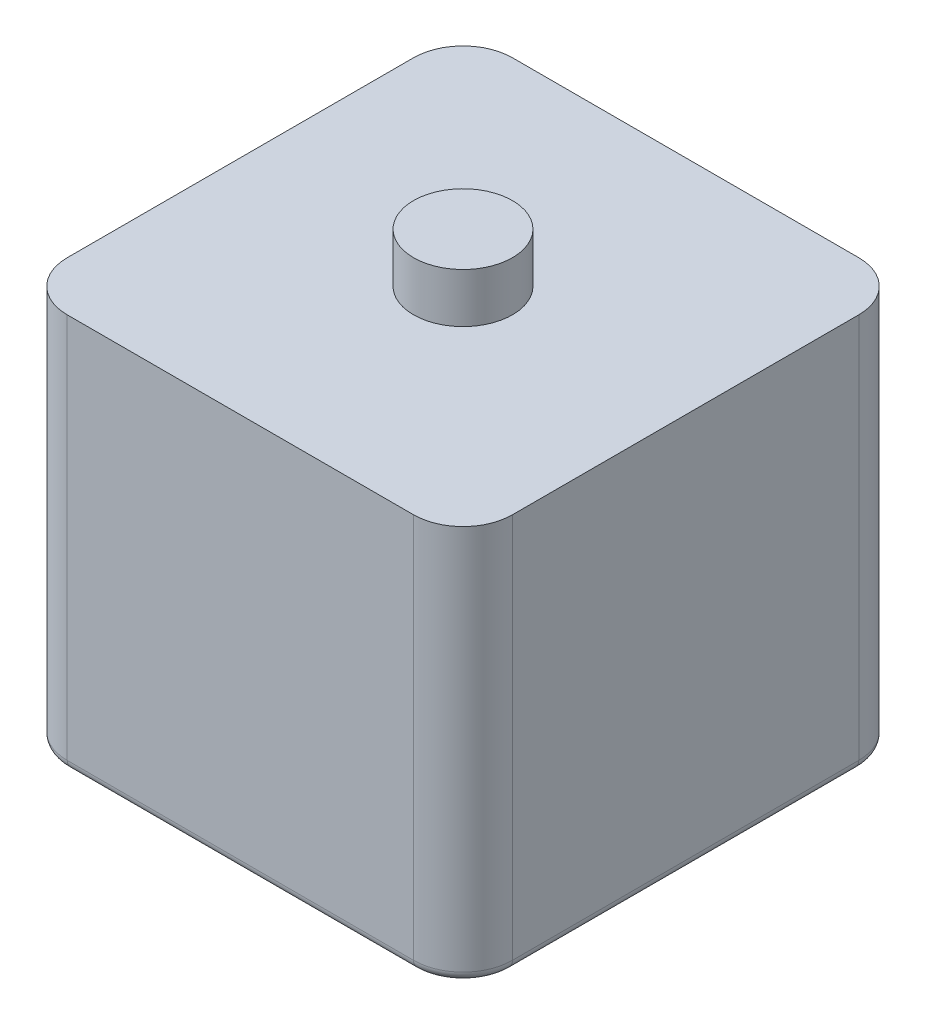
ISO-10303-21;
HEADER;
FILE_DESCRIPTION(('STEP AP214'),'2;1');
FILE_NAME('part.step','',(''),(''),'','','');
FILE_SCHEMA(('AUTOMOTIVE_DESIGN { 1 0 10303 214 1 1 1 1 }'));
ENDSEC;
DATA;
#1=APPLICATION_CONTEXT('core data for automotive mechanical design processes');
#2=APPLICATION_PROTOCOL_DEFINITION('international standard','automotive_design',2000,#1);
#3=PRODUCT_CONTEXT('',#1,'mechanical');
#4=PRODUCT('Part','Part','',(#3));
#5=PRODUCT_RELATED_PRODUCT_CATEGORY('part','',(#4));
#6=PRODUCT_DEFINITION_FORMATION('','',#4);
#7=PRODUCT_DEFINITION_CONTEXT('part definition',#1,'design');
#8=PRODUCT_DEFINITION('design','',#6,#7);
#9=PRODUCT_DEFINITION_SHAPE('','',#8);
#10=(LENGTH_UNIT() NAMED_UNIT(*) SI_UNIT(.MILLI.,.METRE.));
#11=(NAMED_UNIT(*) PLANE_ANGLE_UNIT() SI_UNIT($,.RADIAN.));
#12=(NAMED_UNIT(*) SI_UNIT($,.STERADIAN.) SOLID_ANGLE_UNIT());
#13=UNCERTAINTY_MEASURE_WITH_UNIT(LENGTH_MEASURE(1.E-05),#10,'distance_accuracy_value','');
#14=(GEOMETRIC_REPRESENTATION_CONTEXT(3) GLOBAL_UNCERTAINTY_ASSIGNED_CONTEXT((#13)) GLOBAL_UNIT_ASSIGNED_CONTEXT((#10,
#11,#12)) REPRESENTATION_CONTEXT('',''));
#15=CARTESIAN_POINT('',(0.,0.,0.));
#16=DIRECTION('',(0.,0.,1.));
#17=DIRECTION('',(1.,0.,0.));
#18=AXIS2_PLACEMENT_3D('',#15,#16,#17);
#19=CARTESIAN_POINT('',(0.,45.,0.));
#20=DIRECTION('',(0.,-1.,0.));
#21=DIRECTION('',(0.,0.,-1.));
#22=AXIS2_PLACEMENT_3D('',#19,#20,#21);
#23=CYLINDRICAL_SURFACE('',#22,5.);
#24=CARTESIAN_POINT('',(0.,45.,0.));
#25=DIRECTION('',(0.,1.,0.));
#26=DIRECTION('',(0.,0.,1.));
#27=AXIS2_PLACEMENT_3D('',#24,#25,#26);
#28=CIRCLE('',#27,5.);
#29=CARTESIAN_POINT('',(0.,45.,5.));
#30=VERTEX_POINT('',#29);
#31=EDGE_CURVE('E11',#30,#30,#28,.T.);
#32=ORIENTED_EDGE('',*,*,#31,.F.);
#33=EDGE_LOOP('',(#32));
#34=FACE_BOUND('',#33,.T.);
#35=CARTESIAN_POINT('',(0.,40.,0.));
#36=DIRECTION('',(0.,1.,0.));
#37=DIRECTION('',(0.,0.,1.));
#38=AXIS2_PLACEMENT_3D('',#35,#36,#37);
#39=CIRCLE('',#38,5.);
#40=CARTESIAN_POINT('',(0.,40.,5.));
#41=VERTEX_POINT('',#40);
#42=EDGE_CURVE('E46',#41,#41,#39,.T.);
#43=ORIENTED_EDGE('',*,*,#42,.T.);
#44=EDGE_LOOP('',(#43));
#45=FACE_BOUND('',#44,.T.);
#46=ADVANCED_FACE('F43',(#34,#45),#23,.T.);
#47=CARTESIAN_POINT('',(0.,45.,0.));
#48=DIRECTION('',(0.,1.,0.));
#49=DIRECTION('',(0.,0.,1.));
#50=AXIS2_PLACEMENT_3D('',#47,#48,#49);
#51=PLANE('',#50);
#52=ORIENTED_EDGE('',*,*,#31,.T.);
#53=EDGE_LOOP('',(#52));
#54=FACE_BOUND('',#53,.T.);
#55=ADVANCED_FACE('F58',(#54),#51,.T.);
#56=CARTESIAN_POINT('',(0.,40.,0.));
#57=DIRECTION('',(0.,1.,0.));
#58=DIRECTION('',(0.,0.,1.));
#59=AXIS2_PLACEMENT_3D('',#56,#57,#58);
#60=PLANE('',#59);
#61=ORIENTED_EDGE('',*,*,#42,.F.);
#62=EDGE_LOOP('',(#61));
#63=FACE_BOUND('',#62,.T.);
#64=ADVANCED_FACE('F56',(#63),#60,.F.);
#65=CLOSED_SHELL('',(#46,#55,#64));
#66=MANIFOLD_SOLID_BREP('B2',#65);
#67=CARTESIAN_POINT('',(-22.5,0.,-22.5));
#68=DIRECTION('',(0.,1.,0.));
#69=DIRECTION('',(0.,0.,1.));
#70=AXIS2_PLACEMENT_3D('',#67,#68,#69);
#71=PLANE('',#70);
#72=CARTESIAN_POINT('',(0.,0.,0.));
#73=DIRECTION('',(0.,1.,0.));
#74=DIRECTION('',(0.,0.,1.));
#75=AXIS2_PLACEMENT_3D('',#72,#73,#74);
#76=CIRCLE('',#75,16.);
#77=CARTESIAN_POINT('',(0.,0.,16.));
#78=VERTEX_POINT('',#77);
#79=EDGE_CURVE('E244',#78,#78,#76,.T.);
#80=ORIENTED_EDGE('',*,*,#79,.T.);
#81=EDGE_LOOP('',(#80));
#82=FACE_BOUND('',#81,.T.);
#83=DIRECTION('',(1.,0.,0.));
#84=VECTOR('',#83,1.);
#85=CARTESIAN_POINT('',(-22.5,0.,21.5));
#86=LINE('',#85,#84);
#87=CARTESIAN_POINT('',(17.5,0.,21.5));
#88=VERTEX_POINT('',#87);
#89=CARTESIAN_POINT('',(-17.5,0.,21.5));
#90=VERTEX_POINT('',#89);
#91=EDGE_CURVE('E239',#88,#90,#86,.F.);
#92=ORIENTED_EDGE('',*,*,#91,.T.);
#93=CARTESIAN_POINT('',(-17.5,0.,17.5));
#94=DIRECTION('',(0.,1.,0.));
#95=DIRECTION('',(0.,0.,1.));
#96=AXIS2_PLACEMENT_3D('',#93,#94,#95);
#97=CIRCLE('',#96,4.);
#98=CARTESIAN_POINT('',(-21.5,0.,17.5));
#99=VERTEX_POINT('',#98);
#100=EDGE_CURVE('E241',#90,#99,#97,.F.);
#101=ORIENTED_EDGE('',*,*,#100,.T.);
#102=DIRECTION('',(0.,0.,1.));
#103=VECTOR('',#102,1.);
#104=CARTESIAN_POINT('',(-21.5,0.,-22.5));
#105=LINE('',#104,#103);
#106=CARTESIAN_POINT('',(-21.5,0.,-17.5));
#107=VERTEX_POINT('',#106);
#108=EDGE_CURVE('E227',#99,#107,#105,.F.);
#109=ORIENTED_EDGE('',*,*,#108,.T.);
#110=CARTESIAN_POINT('',(-17.5,0.,-17.5));
#111=DIRECTION('',(0.,1.,0.));
#112=DIRECTION('',(0.,0.,1.));
#113=AXIS2_PLACEMENT_3D('',#110,#111,#112);
#114=CIRCLE('',#113,4.);
#115=CARTESIAN_POINT('',(-17.5,0.,-21.5));
#116=VERTEX_POINT('',#115);
#117=EDGE_CURVE('E229',#107,#116,#114,.F.);
#118=ORIENTED_EDGE('',*,*,#117,.T.);
#119=DIRECTION('',(-1.,0.,0.));
#120=VECTOR('',#119,1.);
#121=CARTESIAN_POINT('',(-22.5,0.,-21.5));
#122=LINE('',#121,#120);
#123=CARTESIAN_POINT('',(17.5,0.,-21.5));
#124=VERTEX_POINT('',#123);
#125=EDGE_CURVE('E231',#116,#124,#122,.F.);
#126=ORIENTED_EDGE('',*,*,#125,.T.);
#127=CARTESIAN_POINT('',(17.5,0.,-17.5));
#128=DIRECTION('',(0.,1.,0.));
#129=DIRECTION('',(0.,0.,1.));
#130=AXIS2_PLACEMENT_3D('',#127,#128,#129);
#131=CIRCLE('',#130,4.);
#132=CARTESIAN_POINT('',(21.5,0.,-17.5));
#133=VERTEX_POINT('',#132);
#134=EDGE_CURVE('E233',#124,#133,#131,.F.);
#135=ORIENTED_EDGE('',*,*,#134,.T.);
#136=DIRECTION('',(0.,0.,-1.));
#137=VECTOR('',#136,1.);
#138=CARTESIAN_POINT('',(21.5,0.,-22.5));
#139=LINE('',#138,#137);
#140=CARTESIAN_POINT('',(21.5,0.,17.5));
#141=VERTEX_POINT('',#140);
#142=EDGE_CURVE('E235',#133,#141,#139,.F.);
#143=ORIENTED_EDGE('',*,*,#142,.T.);
#144=CARTESIAN_POINT('',(17.5,0.,17.5));
#145=DIRECTION('',(0.,1.,0.));
#146=DIRECTION('',(0.,0.,1.));
#147=AXIS2_PLACEMENT_3D('',#144,#145,#146);
#148=CIRCLE('',#147,4.);
#149=EDGE_CURVE('E237',#141,#88,#148,.F.);
#150=ORIENTED_EDGE('',*,*,#149,.T.);
#151=EDGE_LOOP('',(#92,#101,#109,#118,#126,#135,#143,#150));
#152=FACE_BOUND('',#151,.T.);
#153=ADVANCED_FACE('F84',(#82,#152),#71,.F.);
#154=CARTESIAN_POINT('',(-22.5,40.,22.5));
#155=DIRECTION('',(1.,0.,0.));
#156=DIRECTION('',(0.,0.,-1.));
#157=AXIS2_PLACEMENT_3D('',#154,#155,#156);
#158=PLANE('',#157);
#159=DIRECTION('',(0.,-1.,0.));
#160=VECTOR('',#159,1.);
#161=CARTESIAN_POINT('',(-22.5,40.,-17.5));
#162=LINE('',#161,#160);
#163=CARTESIAN_POINT('',(-22.5,40.,-17.5));
#164=VERTEX_POINT('',#163);
#165=CARTESIAN_POINT('',(-22.5,1.,-17.5));
#166=VERTEX_POINT('',#165);
#167=EDGE_CURVE('E188',#164,#166,#162,.T.);
#168=ORIENTED_EDGE('',*,*,#167,.T.);
#169=DIRECTION('',(0.,0.,1.));
#170=VECTOR('',#169,1.);
#171=CARTESIAN_POINT('',(-22.5,1.,22.5));
#172=LINE('',#171,#170);
#173=CARTESIAN_POINT('',(-22.5,1.,17.5));
#174=VERTEX_POINT('',#173);
#175=EDGE_CURVE('E41',#166,#174,#172,.T.);
#176=ORIENTED_EDGE('',*,*,#175,.T.);
#177=DIRECTION('',(0.,-1.,0.));
#178=VECTOR('',#177,1.);
#179=CARTESIAN_POINT('',(-22.5,40.,17.5));
#180=LINE('',#179,#178);
#181=CARTESIAN_POINT('',(-22.5,40.,17.5));
#182=VERTEX_POINT('',#181);
#183=EDGE_CURVE('E191',#174,#182,#180,.F.);
#184=ORIENTED_EDGE('',*,*,#183,.T.);
#185=DIRECTION('',(0.,0.,1.));
#186=VECTOR('',#185,1.);
#187=CARTESIAN_POINT('',(-22.5,40.,22.5));
#188=LINE('',#187,#186);
#189=EDGE_CURVE('E179',#164,#182,#188,.T.);
#190=ORIENTED_EDGE('',*,*,#189,.F.);
#191=EDGE_LOOP('',(#168,#176,#184,#190));
#192=FACE_BOUND('',#191,.T.);
#193=ADVANCED_FACE('F187',(#192),#158,.F.);
#194=CARTESIAN_POINT('',(22.5,40.,22.5));
#195=DIRECTION('',(0.,0.,-1.));
#196=DIRECTION('',(-1.,0.,0.));
#197=AXIS2_PLACEMENT_3D('',#194,#195,#196);
#198=PLANE('',#197);
#199=DIRECTION('',(0.,-1.,0.));
#200=VECTOR('',#199,1.);
#201=CARTESIAN_POINT('',(-17.5,40.,22.5));
#202=LINE('',#201,#200);
#203=CARTESIAN_POINT('',(-17.5,40.,22.5));
#204=VERTEX_POINT('',#203);
#205=CARTESIAN_POINT('',(-17.5,1.,22.5));
#206=VERTEX_POINT('',#205);
#207=EDGE_CURVE('E213',#204,#206,#202,.T.);
#208=ORIENTED_EDGE('',*,*,#207,.T.);
#209=DIRECTION('',(1.,0.,0.));
#210=VECTOR('',#209,1.);
#211=CARTESIAN_POINT('',(22.5,1.,22.5));
#212=LINE('',#211,#210);
#213=CARTESIAN_POINT('',(17.5,1.,22.5));
#214=VERTEX_POINT('',#213);
#215=EDGE_CURVE('E250',#206,#214,#212,.T.);
#216=ORIENTED_EDGE('',*,*,#215,.T.);
#217=DIRECTION('',(0.,-1.,0.));
#218=VECTOR('',#217,1.);
#219=CARTESIAN_POINT('',(17.5,40.,22.5));
#220=LINE('',#219,#218);
#221=CARTESIAN_POINT('',(17.5,40.,22.5));
#222=VERTEX_POINT('',#221);
#223=EDGE_CURVE('E216',#214,#222,#220,.F.);
#224=ORIENTED_EDGE('',*,*,#223,.T.);
#225=DIRECTION('',(1.,0.,0.));
#226=VECTOR('',#225,1.);
#227=CARTESIAN_POINT('',(22.5,40.,22.5));
#228=LINE('',#227,#226);
#229=EDGE_CURVE('E192',#204,#222,#228,.T.);
#230=ORIENTED_EDGE('',*,*,#229,.F.);
#231=EDGE_LOOP('',(#208,#216,#224,#230));
#232=FACE_BOUND('',#231,.T.);
#233=ADVANCED_FACE('F337',(#232),#198,.F.);
#234=CARTESIAN_POINT('',(22.5,40.,22.5));
#235=DIRECTION('',(-1.,0.,0.));
#236=DIRECTION('',(0.,0.,1.));
#237=AXIS2_PLACEMENT_3D('',#234,#235,#236);
#238=PLANE('',#237);
#239=DIRECTION('',(0.,-1.,0.));
#240=VECTOR('',#239,1.);
#241=CARTESIAN_POINT('',(22.5,40.,17.5));
#242=LINE('',#241,#240);
#243=CARTESIAN_POINT('',(22.5,40.,17.5));
#244=VERTEX_POINT('',#243);
#245=CARTESIAN_POINT('',(22.5,1.,17.5));
#246=VERTEX_POINT('',#245);
#247=EDGE_CURVE('E183',#244,#246,#242,.T.);
#248=ORIENTED_EDGE('',*,*,#247,.T.);
#249=DIRECTION('',(0.,0.,-1.));
#250=VECTOR('',#249,1.);
#251=CARTESIAN_POINT('',(22.5,1.,22.5));
#252=LINE('',#251,#250);
#253=CARTESIAN_POINT('',(22.5,1.,-17.5));
#254=VERTEX_POINT('',#253);
#255=EDGE_CURVE('E254',#246,#254,#252,.T.);
#256=ORIENTED_EDGE('',*,*,#255,.T.);
#257=DIRECTION('',(0.,-1.,0.));
#258=VECTOR('',#257,1.);
#259=CARTESIAN_POINT('',(22.5,40.,-17.5));
#260=LINE('',#259,#258);
#261=CARTESIAN_POINT('',(22.5,40.,-17.5));
#262=VERTEX_POINT('',#261);
#263=EDGE_CURVE('E211',#254,#262,#260,.F.);
#264=ORIENTED_EDGE('',*,*,#263,.T.);
#265=DIRECTION('',(0.,0.,-1.));
#266=VECTOR('',#265,1.);
#267=CARTESIAN_POINT('',(22.5,40.,22.5));
#268=LINE('',#267,#266);
#269=EDGE_CURVE('E297',#244,#262,#268,.T.);
#270=ORIENTED_EDGE('',*,*,#269,.F.);
#271=EDGE_LOOP('',(#248,#256,#264,#270));
#272=FACE_BOUND('',#271,.T.);
#273=ADVANCED_FACE('F347',(#272),#238,.F.);
#274=CARTESIAN_POINT('',(22.5,40.,-22.5));
#275=DIRECTION('',(0.,0.,1.));
#276=DIRECTION('',(1.,0.,0.));
#277=AXIS2_PLACEMENT_3D('',#274,#275,#276);
#278=PLANE('',#277);
#279=DIRECTION('',(0.,-1.,0.));
#280=VECTOR('',#279,1.);
#281=CARTESIAN_POINT('',(17.5,40.,-22.5));
#282=LINE('',#281,#280);
#283=CARTESIAN_POINT('',(17.5,40.,-22.5));
#284=VERTEX_POINT('',#283);
#285=CARTESIAN_POINT('',(17.5,1.,-22.5));
#286=VERTEX_POINT('',#285);
#287=EDGE_CURVE('E196',#284,#286,#282,.T.);
#288=ORIENTED_EDGE('',*,*,#287,.T.);
#289=DIRECTION('',(-1.,0.,0.));
#290=VECTOR('',#289,1.);
#291=CARTESIAN_POINT('',(22.5,1.,-22.5));
#292=LINE('',#291,#290);
#293=CARTESIAN_POINT('',(-17.5,1.,-22.5));
#294=VERTEX_POINT('',#293);
#295=EDGE_CURVE('E108',#286,#294,#292,.T.);
#296=ORIENTED_EDGE('',*,*,#295,.T.);
#297=DIRECTION('',(0.,-1.,0.));
#298=VECTOR('',#297,1.);
#299=CARTESIAN_POINT('',(-17.5,40.,-22.5));
#300=LINE('',#299,#298);
#301=CARTESIAN_POINT('',(-17.5,40.,-22.5));
#302=VERTEX_POINT('',#301);
#303=EDGE_CURVE('E198',#294,#302,#300,.F.);
#304=ORIENTED_EDGE('',*,*,#303,.T.);
#305=DIRECTION('',(-1.,0.,0.));
#306=VECTOR('',#305,1.);
#307=CARTESIAN_POINT('',(22.5,40.,-22.5));
#308=LINE('',#307,#306);
#309=EDGE_CURVE('E182',#284,#302,#308,.T.);
#310=ORIENTED_EDGE('',*,*,#309,.F.);
#311=EDGE_LOOP('',(#288,#296,#304,#310));
#312=FACE_BOUND('',#311,.T.);
#313=ADVANCED_FACE('F309',(#312),#278,.F.);
#314=CARTESIAN_POINT('',(-22.5,40.,-22.5));
#315=DIRECTION('',(0.,1.,0.));
#316=DIRECTION('',(0.,0.,1.));
#317=AXIS2_PLACEMENT_3D('',#314,#315,#316);
#318=PLANE('',#317);
#319=CARTESIAN_POINT('',(0.,40.,0.));
#320=DIRECTION('',(0.,1.,0.));
#321=DIRECTION('',(0.,0.,1.));
#322=AXIS2_PLACEMENT_3D('',#319,#320,#321);
#323=CIRCLE('',#322,5.);
#324=CARTESIAN_POINT('',(0.,40.,5.));
#325=VERTEX_POINT('',#324);
#326=EDGE_CURVE('E282',#325,#325,#323,.T.);
#327=ORIENTED_EDGE('',*,*,#326,.F.);
#328=EDGE_LOOP('',(#327));
#329=FACE_BOUND('',#328,.T.);
#330=ORIENTED_EDGE('',*,*,#309,.T.);
#331=CARTESIAN_POINT('',(-17.5,40.,-17.5));
#332=DIRECTION('',(0.,1.,0.));
#333=DIRECTION('',(0.,0.,1.));
#334=AXIS2_PLACEMENT_3D('',#331,#332,#333);
#335=CIRCLE('',#334,5.);
#336=EDGE_CURVE('E176',#302,#164,#335,.T.);
#337=ORIENTED_EDGE('',*,*,#336,.T.);
#338=ORIENTED_EDGE('',*,*,#189,.T.);
#339=CARTESIAN_POINT('',(-17.5,40.,17.5));
#340=DIRECTION('',(0.,1.,0.));
#341=DIRECTION('',(0.,0.,1.));
#342=AXIS2_PLACEMENT_3D('',#339,#340,#341);
#343=CIRCLE('',#342,5.);
#344=EDGE_CURVE('E204',#182,#204,#343,.T.);
#345=ORIENTED_EDGE('',*,*,#344,.T.);
#346=ORIENTED_EDGE('',*,*,#229,.T.);
#347=CARTESIAN_POINT('',(17.5,40.,17.5));
#348=DIRECTION('',(0.,1.,0.));
#349=DIRECTION('',(0.,0.,1.));
#350=AXIS2_PLACEMENT_3D('',#347,#348,#349);
#351=CIRCLE('',#350,5.);
#352=EDGE_CURVE('E206',#222,#244,#351,.T.);
#353=ORIENTED_EDGE('',*,*,#352,.T.);
#354=ORIENTED_EDGE('',*,*,#269,.T.);
#355=CARTESIAN_POINT('',(17.5,40.,-17.5));
#356=DIRECTION('',(0.,1.,0.));
#357=DIRECTION('',(0.,0.,1.));
#358=AXIS2_PLACEMENT_3D('',#355,#356,#357);
#359=CIRCLE('',#358,5.);
#360=EDGE_CURVE('E184',#262,#284,#359,.T.);
#361=ORIENTED_EDGE('',*,*,#360,.T.);
#362=EDGE_LOOP('',(#330,#337,#338,#345,#346,#353,#354,#361));
#363=FACE_BOUND('',#362,.T.);
#364=ADVANCED_FACE('F178',(#329,#363),#318,.T.);
#365=CARTESIAN_POINT('',(0.,30.,0.));
#366=DIRECTION('',(0.,1.,0.));
#367=DIRECTION('',(0.,0.,1.));
#368=AXIS2_PLACEMENT_3D('',#365,#366,#367);
#369=CYLINDRICAL_SURFACE('',#368,5.);
#370=CARTESIAN_POINT('',(0.,30.,0.));
#371=DIRECTION('',(0.,1.,0.));
#372=DIRECTION('',(0.,0.,1.));
#373=AXIS2_PLACEMENT_3D('',#370,#371,#372);
#374=CIRCLE('',#373,5.);
#375=CARTESIAN_POINT('',(0.,30.,5.));
#376=VERTEX_POINT('',#375);
#377=EDGE_CURVE('E193',#376,#376,#374,.T.);
#378=ORIENTED_EDGE('',*,*,#377,.F.);
#379=EDGE_LOOP('',(#378));
#380=FACE_BOUND('',#379,.T.);
#381=ORIENTED_EDGE('',*,*,#326,.T.);
#382=EDGE_LOOP('',(#381));
#383=FACE_BOUND('',#382,.T.);
#384=ADVANCED_FACE('F367',(#380,#383),#369,.F.);
#385=CARTESIAN_POINT('',(0.,30.,0.));
#386=DIRECTION('',(0.,1.,0.));
#387=DIRECTION('',(0.,0.,1.));
#388=AXIS2_PLACEMENT_3D('',#385,#386,#387);
#389=PLANE('',#388);
#390=ORIENTED_EDGE('',*,*,#377,.T.);
#391=EDGE_LOOP('',(#390));
#392=FACE_BOUND('',#391,.T.);
#393=ADVANCED_FACE('F371',(#392),#389,.T.);
#394=CARTESIAN_POINT('',(-17.5,40.,-17.5));
#395=DIRECTION('',(0.,-1.,0.));
#396=DIRECTION('',(0.,0.,-1.));
#397=AXIS2_PLACEMENT_3D('',#394,#395,#396);
#398=CYLINDRICAL_SURFACE('',#397,5.);
#399=ORIENTED_EDGE('',*,*,#303,.F.);
#400=CARTESIAN_POINT('',(-17.5,1.,-17.5));
#401=DIRECTION('',(0.,1.,0.));
#402=DIRECTION('',(0.,0.,1.));
#403=AXIS2_PLACEMENT_3D('',#400,#401,#402);
#404=CIRCLE('',#403,5.);
#405=EDGE_CURVE('E93',#294,#166,#404,.T.);
#406=ORIENTED_EDGE('',*,*,#405,.T.);
#407=ORIENTED_EDGE('',*,*,#167,.F.);
#408=ORIENTED_EDGE('',*,*,#336,.F.);
#409=EDGE_LOOP('',(#399,#406,#407,#408));
#410=FACE_BOUND('',#409,.T.);
#411=ADVANCED_FACE('F195',(#410),#398,.T.);
#412=CARTESIAN_POINT('',(17.5,40.,-17.5));
#413=DIRECTION('',(0.,-1.,0.));
#414=DIRECTION('',(0.,0.,-1.));
#415=AXIS2_PLACEMENT_3D('',#412,#413,#414);
#416=CYLINDRICAL_SURFACE('',#415,5.);
#417=ORIENTED_EDGE('',*,*,#263,.F.);
#418=CARTESIAN_POINT('',(17.5,1.,-17.5));
#419=DIRECTION('',(0.,1.,0.));
#420=DIRECTION('',(0.,0.,1.));
#421=AXIS2_PLACEMENT_3D('',#418,#419,#420);
#422=CIRCLE('',#421,5.);
#423=EDGE_CURVE('E256',#254,#286,#422,.T.);
#424=ORIENTED_EDGE('',*,*,#423,.T.);
#425=ORIENTED_EDGE('',*,*,#287,.F.);
#426=ORIENTED_EDGE('',*,*,#360,.F.);
#427=EDGE_LOOP('',(#417,#424,#425,#426));
#428=FACE_BOUND('',#427,.T.);
#429=ADVANCED_FACE('F307',(#428),#416,.T.);
#430=CARTESIAN_POINT('',(17.5,40.,17.5));
#431=DIRECTION('',(0.,-1.,0.));
#432=DIRECTION('',(0.,0.,-1.));
#433=AXIS2_PLACEMENT_3D('',#430,#431,#432);
#434=CYLINDRICAL_SURFACE('',#433,5.);
#435=ORIENTED_EDGE('',*,*,#223,.F.);
#436=CARTESIAN_POINT('',(17.5,1.,17.5));
#437=DIRECTION('',(0.,1.,0.));
#438=DIRECTION('',(0.,0.,1.));
#439=AXIS2_PLACEMENT_3D('',#436,#437,#438);
#440=CIRCLE('',#439,5.);
#441=EDGE_CURVE('E252',#214,#246,#440,.T.);
#442=ORIENTED_EDGE('',*,*,#441,.T.);
#443=ORIENTED_EDGE('',*,*,#247,.F.);
#444=ORIENTED_EDGE('',*,*,#352,.F.);
#445=EDGE_LOOP('',(#435,#442,#443,#444));
#446=FACE_BOUND('',#445,.T.);
#447=ADVANCED_FACE('F341',(#446),#434,.T.);
#448=CARTESIAN_POINT('',(-17.5,40.,17.5));
#449=DIRECTION('',(0.,-1.,0.));
#450=DIRECTION('',(0.,0.,-1.));
#451=AXIS2_PLACEMENT_3D('',#448,#449,#450);
#452=CYLINDRICAL_SURFACE('',#451,5.);
#453=ORIENTED_EDGE('',*,*,#183,.F.);
#454=CARTESIAN_POINT('',(-17.5,1.,17.5));
#455=DIRECTION('',(0.,1.,0.));
#456=DIRECTION('',(0.,0.,1.));
#457=AXIS2_PLACEMENT_3D('',#454,#455,#456);
#458=CIRCLE('',#457,5.);
#459=EDGE_CURVE('E247',#174,#206,#458,.T.);
#460=ORIENTED_EDGE('',*,*,#459,.T.);
#461=ORIENTED_EDGE('',*,*,#207,.F.);
#462=ORIENTED_EDGE('',*,*,#344,.F.);
#463=EDGE_LOOP('',(#453,#460,#461,#462));
#464=FACE_BOUND('',#463,.T.);
#465=ADVANCED_FACE('F324',(#464),#452,.T.);
#466=CARTESIAN_POINT('',(0.,-5.,0.));
#467=DIRECTION('',(0.,1.,0.));
#468=DIRECTION('',(0.,0.,1.));
#469=AXIS2_PLACEMENT_3D('',#466,#467,#468);
#470=CYLINDRICAL_SURFACE('',#469,15.);
#471=CARTESIAN_POINT('',(0.,-1.,0.));
#472=DIRECTION('',(0.,1.,0.));
#473=DIRECTION('',(0.,0.,1.));
#474=AXIS2_PLACEMENT_3D('',#471,#472,#473);
#475=CIRCLE('',#474,15.);
#476=CARTESIAN_POINT('',(0.,-1.,15.));
#477=VERTEX_POINT('',#476);
#478=EDGE_CURVE('E224',#477,#477,#475,.F.);
#479=ORIENTED_EDGE('',*,*,#478,.T.);
#480=EDGE_LOOP('',(#479));
#481=FACE_BOUND('',#480,.T.);
#482=CARTESIAN_POINT('',(0.,-3.,0.));
#483=DIRECTION('',(0.,-1.,0.));
#484=DIRECTION('',(0.,0.,-1.));
#485=AXIS2_PLACEMENT_3D('',#482,#483,#484);
#486=CIRCLE('',#485,15.);
#487=CARTESIAN_POINT('',(0.,-3.,-15.));
#488=VERTEX_POINT('',#487);
#489=EDGE_CURVE('E221',#488,#488,#486,.F.);
#490=ORIENTED_EDGE('',*,*,#489,.T.);
#491=EDGE_LOOP('',(#490));
#492=FACE_BOUND('',#491,.T.);
#493=ADVANCED_FACE('F376',(#481,#492),#470,.T.);
#494=CARTESIAN_POINT('',(0.,-5.,0.));
#495=DIRECTION('',(0.,-1.,0.));
#496=DIRECTION('',(0.,0.,-1.));
#497=AXIS2_PLACEMENT_3D('',#494,#495,#496);
#498=PLANE('',#497);
#499=CARTESIAN_POINT('',(0.,-5.,0.));
#500=DIRECTION('',(0.,-1.,0.));
#501=DIRECTION('',(0.,0.,-1.));
#502=AXIS2_PLACEMENT_3D('',#499,#500,#501);
#503=CIRCLE('',#502,4.);
#504=CARTESIAN_POINT('',(0.,-5.,-4.));
#505=VERTEX_POINT('',#504);
#506=EDGE_CURVE('E394',#505,#505,#503,.T.);
#507=ORIENTED_EDGE('',*,*,#506,.F.);
#508=EDGE_LOOP('',(#507));
#509=FACE_BOUND('',#508,.T.);
#510=CARTESIAN_POINT('',(0.,-5.,0.));
#511=DIRECTION('',(0.,-1.,0.));
#512=DIRECTION('',(0.,0.,-1.));
#513=AXIS2_PLACEMENT_3D('',#510,#511,#512);
#514=CIRCLE('',#513,13.);
#515=CARTESIAN_POINT('',(0.,-5.,-13.));
#516=VERTEX_POINT('',#515);
#517=EDGE_CURVE('E218',#516,#516,#514,.T.);
#518=ORIENTED_EDGE('',*,*,#517,.T.);
#519=EDGE_LOOP('',(#518));
#520=FACE_BOUND('',#519,.T.);
#521=ADVANCED_FACE('F379',(#509,#520),#498,.T.);
#522=CARTESIAN_POINT('',(0.,-3.,0.));
#523=DIRECTION('',(0.,-1.,0.));
#524=DIRECTION('',(0.,0.,-1.));
#525=AXIS2_PLACEMENT_3D('',#522,#523,#524);
#526=TOROIDAL_SURFACE('',#525,13.,2.);
#527=ORIENTED_EDGE('',*,*,#489,.F.);
#528=EDGE_LOOP('',(#527));
#529=FACE_BOUND('',#528,.T.);
#530=ORIENTED_EDGE('',*,*,#517,.F.);
#531=EDGE_LOOP('',(#530));
#532=FACE_BOUND('',#531,.T.);
#533=ADVANCED_FACE('F383',(#529,#532),#526,.T.);
#534=CARTESIAN_POINT('',(0.,-1.,0.));
#535=DIRECTION('',(0.,1.,0.));
#536=DIRECTION('',(0.,0.,1.));
#537=AXIS2_PLACEMENT_3D('',#534,#535,#536);
#538=TOROIDAL_SURFACE('',#537,16.,1.);
#539=ORIENTED_EDGE('',*,*,#79,.F.);
#540=EDGE_LOOP('',(#539));
#541=FACE_BOUND('',#540,.T.);
#542=ORIENTED_EDGE('',*,*,#478,.F.);
#543=EDGE_LOOP('',(#542));
#544=FACE_BOUND('',#543,.T.);
#545=ADVANCED_FACE('F403',(#541,#544),#538,.F.);
#546=CARTESIAN_POINT('',(17.5,1.,-17.5));
#547=DIRECTION('',(0.,1.,0.));
#548=DIRECTION('',(0.,0.,1.));
#549=AXIS2_PLACEMENT_3D('',#546,#547,#548);
#550=TOROIDAL_SURFACE('',#549,4.,1.);
#551=CARTESIAN_POINT('',(17.5,1.,-21.5));
#552=DIRECTION('',(-1.,0.,0.));
#553=DIRECTION('',(0.,0.,1.));
#554=AXIS2_PLACEMENT_3D('',#551,#552,#553);
#555=CIRCLE('',#554,1.);
#556=EDGE_CURVE('E276',#286,#124,#555,.T.);
#557=ORIENTED_EDGE('',*,*,#556,.F.);
#558=ORIENTED_EDGE('',*,*,#423,.F.);
#559=CARTESIAN_POINT('',(21.5,1.,-17.5));
#560=DIRECTION('',(0.,0.,1.));
#561=DIRECTION('',(1.,0.,0.));
#562=AXIS2_PLACEMENT_3D('',#559,#560,#561);
#563=CIRCLE('',#562,1.);
#564=EDGE_CURVE('E88',#133,#254,#563,.T.);
#565=ORIENTED_EDGE('',*,*,#564,.F.);
#566=ORIENTED_EDGE('',*,*,#134,.F.);
#567=EDGE_LOOP('',(#557,#558,#565,#566));
#568=FACE_BOUND('',#567,.T.);
#569=ADVANCED_FACE('F86',(#568),#550,.T.);
#570=CARTESIAN_POINT('',(21.5,1.,22.5));
#571=DIRECTION('',(0.,0.,-1.));
#572=DIRECTION('',(-1.,0.,0.));
#573=AXIS2_PLACEMENT_3D('',#570,#571,#572);
#574=CYLINDRICAL_SURFACE('',#573,1.);
#575=ORIENTED_EDGE('',*,*,#564,.T.);
#576=ORIENTED_EDGE('',*,*,#255,.F.);
#577=CARTESIAN_POINT('',(21.5,1.,17.5));
#578=DIRECTION('',(0.,0.,1.));
#579=DIRECTION('',(1.,0.,0.));
#580=AXIS2_PLACEMENT_3D('',#577,#578,#579);
#581=CIRCLE('',#580,1.);
#582=EDGE_CURVE('E274',#141,#246,#581,.T.);
#583=ORIENTED_EDGE('',*,*,#582,.F.);
#584=ORIENTED_EDGE('',*,*,#142,.F.);
#585=EDGE_LOOP('',(#575,#576,#583,#584));
#586=FACE_BOUND('',#585,.T.);
#587=ADVANCED_FACE('F346',(#586),#574,.T.);
#588=CARTESIAN_POINT('',(22.5,1.,-21.5));
#589=DIRECTION('',(-1.,0.,0.));
#590=DIRECTION('',(0.,0.,1.));
#591=AXIS2_PLACEMENT_3D('',#588,#589,#590);
#592=CYLINDRICAL_SURFACE('',#591,1.);
#593=ORIENTED_EDGE('',*,*,#556,.T.);
#594=ORIENTED_EDGE('',*,*,#125,.F.);
#595=CARTESIAN_POINT('',(-17.5,1.,-21.5));
#596=DIRECTION('',(-1.,0.,0.));
#597=DIRECTION('',(0.,0.,1.));
#598=AXIS2_PLACEMENT_3D('',#595,#596,#597);
#599=CIRCLE('',#598,1.);
#600=EDGE_CURVE('E271',#294,#116,#599,.T.);
#601=ORIENTED_EDGE('',*,*,#600,.F.);
#602=ORIENTED_EDGE('',*,*,#295,.F.);
#603=EDGE_LOOP('',(#593,#594,#601,#602));
#604=FACE_BOUND('',#603,.T.);
#605=ADVANCED_FACE('F313',(#604),#592,.T.);
#606=CARTESIAN_POINT('',(17.5,1.,17.5));
#607=DIRECTION('',(0.,1.,0.));
#608=DIRECTION('',(0.,0.,1.));
#609=AXIS2_PLACEMENT_3D('',#606,#607,#608);
#610=TOROIDAL_SURFACE('',#609,4.,1.);
#611=ORIENTED_EDGE('',*,*,#582,.T.);
#612=ORIENTED_EDGE('',*,*,#441,.F.);
#613=CARTESIAN_POINT('',(17.5,1.,21.5));
#614=DIRECTION('',(-1.,0.,0.));
#615=DIRECTION('',(0.,0.,1.));
#616=AXIS2_PLACEMENT_3D('',#613,#614,#615);
#617=CIRCLE('',#616,1.);
#618=EDGE_CURVE('E268',#88,#214,#617,.T.);
#619=ORIENTED_EDGE('',*,*,#618,.F.);
#620=ORIENTED_EDGE('',*,*,#149,.F.);
#621=EDGE_LOOP('',(#611,#612,#619,#620));
#622=FACE_BOUND('',#621,.T.);
#623=ADVANCED_FACE('F343',(#622),#610,.T.);
#624=CARTESIAN_POINT('',(-17.5,1.,-17.5));
#625=DIRECTION('',(0.,1.,0.));
#626=DIRECTION('',(0.,0.,1.));
#627=AXIS2_PLACEMENT_3D('',#624,#625,#626);
#628=TOROIDAL_SURFACE('',#627,4.,1.);
#629=ORIENTED_EDGE('',*,*,#600,.T.);
#630=ORIENTED_EDGE('',*,*,#117,.F.);
#631=CARTESIAN_POINT('',(-21.5,1.,-17.5));
#632=DIRECTION('',(0.,0.,1.));
#633=DIRECTION('',(1.,0.,0.));
#634=AXIS2_PLACEMENT_3D('',#631,#632,#633);
#635=CIRCLE('',#634,1.);
#636=EDGE_CURVE('E265',#166,#107,#635,.T.);
#637=ORIENTED_EDGE('',*,*,#636,.F.);
#638=ORIENTED_EDGE('',*,*,#405,.F.);
#639=EDGE_LOOP('',(#629,#630,#637,#638));
#640=FACE_BOUND('',#639,.T.);
#641=ADVANCED_FACE('F316',(#640),#628,.T.);
#642=CARTESIAN_POINT('',(22.5,1.,21.5));
#643=DIRECTION('',(1.,0.,0.));
#644=DIRECTION('',(0.,0.,-1.));
#645=AXIS2_PLACEMENT_3D('',#642,#643,#644);
#646=CYLINDRICAL_SURFACE('',#645,1.);
#647=ORIENTED_EDGE('',*,*,#618,.T.);
#648=ORIENTED_EDGE('',*,*,#215,.F.);
#649=CARTESIAN_POINT('',(-17.5,1.,21.5));
#650=DIRECTION('',(-1.,0.,0.));
#651=DIRECTION('',(0.,0.,1.));
#652=AXIS2_PLACEMENT_3D('',#649,#650,#651);
#653=CIRCLE('',#652,1.);
#654=EDGE_CURVE('E262',#90,#206,#653,.T.);
#655=ORIENTED_EDGE('',*,*,#654,.F.);
#656=ORIENTED_EDGE('',*,*,#91,.F.);
#657=EDGE_LOOP('',(#647,#648,#655,#656));
#658=FACE_BOUND('',#657,.T.);
#659=ADVANCED_FACE('F333',(#658),#646,.T.);
#660=CARTESIAN_POINT('',(-21.5,1.,22.5));
#661=DIRECTION('',(0.,0.,1.));
#662=DIRECTION('',(1.,0.,0.));
#663=AXIS2_PLACEMENT_3D('',#660,#661,#662);
#664=CYLINDRICAL_SURFACE('',#663,1.);
#665=ORIENTED_EDGE('',*,*,#636,.T.);
#666=ORIENTED_EDGE('',*,*,#108,.F.);
#667=CARTESIAN_POINT('',(-21.5,1.,17.5));
#668=DIRECTION('',(0.,0.,1.));
#669=DIRECTION('',(1.,0.,0.));
#670=AXIS2_PLACEMENT_3D('',#667,#668,#669);
#671=CIRCLE('',#670,1.);
#672=EDGE_CURVE('E260',#174,#99,#671,.T.);
#673=ORIENTED_EDGE('',*,*,#672,.F.);
#674=ORIENTED_EDGE('',*,*,#175,.F.);
#675=EDGE_LOOP('',(#665,#666,#673,#674));
#676=FACE_BOUND('',#675,.T.);
#677=ADVANCED_FACE('F321',(#676),#664,.T.);
#678=CARTESIAN_POINT('',(-17.5,1.,17.5));
#679=DIRECTION('',(0.,1.,0.));
#680=DIRECTION('',(0.,0.,1.));
#681=AXIS2_PLACEMENT_3D('',#678,#679,#680);
#682=TOROIDAL_SURFACE('',#681,4.,1.);
#683=ORIENTED_EDGE('',*,*,#654,.T.);
#684=ORIENTED_EDGE('',*,*,#459,.F.);
#685=ORIENTED_EDGE('',*,*,#672,.T.);
#686=ORIENTED_EDGE('',*,*,#100,.F.);
#687=EDGE_LOOP('',(#683,#684,#685,#686));
#688=FACE_BOUND('',#687,.T.);
#689=ADVANCED_FACE('F327',(#688),#682,.T.);
#690=CARTESIAN_POINT('',(0.,-4.,0.));
#691=DIRECTION('',(0.,-1.,0.));
#692=DIRECTION('',(0.,0.,-1.));
#693=AXIS2_PLACEMENT_3D('',#690,#691,#692);
#694=CYLINDRICAL_SURFACE('',#693,4.);
#695=CARTESIAN_POINT('',(0.,-4.,0.));
#696=DIRECTION('',(0.,-1.,0.));
#697=DIRECTION('',(0.,0.,-1.));
#698=AXIS2_PLACEMENT_3D('',#695,#696,#697);
#699=CIRCLE('',#698,4.);
#700=CARTESIAN_POINT('',(0.,-4.,-4.));
#701=VERTEX_POINT('',#700);
#702=EDGE_CURVE('E263',#701,#701,#699,.T.);
#703=ORIENTED_EDGE('',*,*,#702,.F.);
#704=EDGE_LOOP('',(#703));
#705=FACE_BOUND('',#704,.T.);
#706=ORIENTED_EDGE('',*,*,#506,.T.);
#707=EDGE_LOOP('',(#706));
#708=FACE_BOUND('',#707,.T.);
#709=ADVANCED_FACE('F385',(#705,#708),#694,.F.);
#710=CARTESIAN_POINT('',(0.,-4.,0.));
#711=DIRECTION('',(0.,-1.,0.));
#712=DIRECTION('',(0.,0.,-1.));
#713=AXIS2_PLACEMENT_3D('',#710,#711,#712);
#714=PLANE('',#713);
#715=ORIENTED_EDGE('',*,*,#702,.T.);
#716=EDGE_LOOP('',(#715));
#717=FACE_BOUND('',#716,.T.);
#718=ADVANCED_FACE('F387',(#717),#714,.T.);
#719=CLOSED_SHELL('',(#153,#193,#233,#273,#313,#364,#384,#393,#411,#429,#447,#465,#493,#521,
#533,#545,#569,#587,#605,#623,#641,#659,#677,#689,#709,#718));
#720=MANIFOLD_SOLID_BREP('B6',#719);
#721=ADVANCED_BREP_SHAPE_REPRESENTATION('',(#18,#66,#720),#14);
#722=SHAPE_DEFINITION_REPRESENTATION(#9,#721);
ENDSEC;
END-ISO-10303-21;
